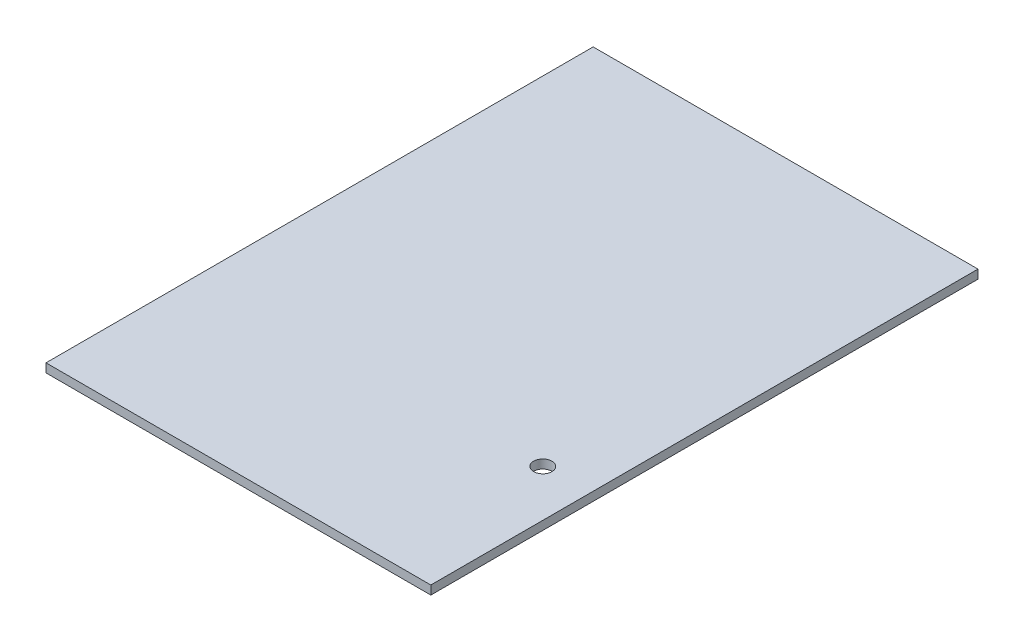
ISO-10303-21;
HEADER;
FILE_DESCRIPTION(('STEP AP214'),'2;1');
FILE_NAME('part.step','',(''),(''),'','','');
FILE_SCHEMA(('AUTOMOTIVE_DESIGN { 1 0 10303 214 1 1 1 1 }'));
ENDSEC;
DATA;
#1=APPLICATION_CONTEXT('core data for automotive mechanical design processes');
#2=APPLICATION_PROTOCOL_DEFINITION('international standard','automotive_design',2000,#1);
#3=PRODUCT_CONTEXT('',#1,'mechanical');
#4=PRODUCT('Part','Part','',(#3));
#5=PRODUCT_RELATED_PRODUCT_CATEGORY('part','',(#4));
#6=PRODUCT_DEFINITION_FORMATION('','',#4);
#7=PRODUCT_DEFINITION_CONTEXT('part definition',#1,'design');
#8=PRODUCT_DEFINITION('design','',#6,#7);
#9=PRODUCT_DEFINITION_SHAPE('','',#8);
#10=(LENGTH_UNIT() NAMED_UNIT(*) SI_UNIT(.MILLI.,.METRE.));
#11=(NAMED_UNIT(*) PLANE_ANGLE_UNIT() SI_UNIT($,.RADIAN.));
#12=(NAMED_UNIT(*) SI_UNIT($,.STERADIAN.) SOLID_ANGLE_UNIT());
#13=UNCERTAINTY_MEASURE_WITH_UNIT(LENGTH_MEASURE(1.E-05),#10,'distance_accuracy_value','');
#14=(GEOMETRIC_REPRESENTATION_CONTEXT(3) GLOBAL_UNCERTAINTY_ASSIGNED_CONTEXT((#13)) GLOBAL_UNIT_ASSIGNED_CONTEXT((#10,
#11,#12)) REPRESENTATION_CONTEXT('',''));
#15=CARTESIAN_POINT('',(0.,0.,0.));
#16=DIRECTION('',(0.,0.,1.));
#17=DIRECTION('',(1.,0.,0.));
#18=AXIS2_PLACEMENT_3D('',#15,#16,#17);
#19=CARTESIAN_POINT('',(0.,0.,0.));
#20=DIRECTION('',(0.,0.,1.));
#21=DIRECTION('',(1.,0.,0.));
#22=AXIS2_PLACEMENT_3D('',#19,#20,#21);
#23=PLANE('',#22);
#24=DIRECTION('',(-1.,0.,0.));
#25=VECTOR('',#24,1.);
#26=CARTESIAN_POINT('',(-262.506364446809,6.71891061329305,0.));
#27=LINE('',#26,#25);
#28=CARTESIAN_POINT('',(-194.506364446809,6.71891061329305,0.));
#29=VERTEX_POINT('',#28);
#30=CARTESIAN_POINT('',(-300.,6.71891061329305,0.));
#31=VERTEX_POINT('',#30);
#32=EDGE_CURVE('E51',#29,#31,#27,.T.);
#33=ORIENTED_EDGE('',*,*,#32,.T.);
#34=DIRECTION('',(0.,-1.,0.));
#35=VECTOR('',#34,1.);
#36=CARTESIAN_POINT('',(-300.,0.,0.));
#37=LINE('',#36,#35);
#38=CARTESIAN_POINT('',(-300.,9.11891061329305,0.));
#39=VERTEX_POINT('',#38);
#40=EDGE_CURVE('E38',#39,#31,#37,.T.);
#41=ORIENTED_EDGE('',*,*,#40,.F.);
#42=DIRECTION('',(-1.,0.,0.));
#43=VECTOR('',#42,1.);
#44=CARTESIAN_POINT('',(-304.054799780113,9.11891061329305,0.));
#45=LINE('',#44,#43);
#46=CARTESIAN_POINT('',(-194.506364446809,9.11891061329307,0.));
#47=VERTEX_POINT('',#46);
#48=EDGE_CURVE('E90',#47,#39,#45,.T.);
#49=ORIENTED_EDGE('',*,*,#48,.F.);
#50=DIRECTION('',(0.,1.,0.));
#51=VECTOR('',#50,1.);
#52=CARTESIAN_POINT('',(-194.506364446809,-59.3810893867069,0.));
#53=LINE('',#52,#51);
#54=EDGE_CURVE('E98',#29,#47,#53,.T.);
#55=ORIENTED_EDGE('',*,*,#54,.F.);
#56=EDGE_LOOP('',(#33,#41,#49,#55));
#57=FACE_BOUND('',#56,.T.);
#58=ADVANCED_FACE('F34',(#57),#23,.F.);
#59=CARTESIAN_POINT('',(-300.,0.,0.));
#60=DIRECTION('',(1.,0.,0.));
#61=DIRECTION('',(0.,0.,-1.));
#62=AXIS2_PLACEMENT_3D('',#59,#60,#61);
#63=PLANE('',#62);
#64=DIRECTION('',(0.,0.,1.));
#65=VECTOR('',#64,1.);
#66=CARTESIAN_POINT('',(-300.,6.71891061329305,-202.589640738144));
#67=LINE('',#66,#65);
#68=CARTESIAN_POINT('',(-300.,6.71891061329305,149.999999999977));
#69=VERTEX_POINT('',#68);
#70=EDGE_CURVE('E95',#31,#69,#67,.T.);
#71=ORIENTED_EDGE('',*,*,#70,.T.);
#72=DIRECTION('',(0.,-1.,0.));
#73=VECTOR('',#72,1.);
#74=CARTESIAN_POINT('',(-300.,0.,150.));
#75=LINE('',#74,#73);
#76=CARTESIAN_POINT('',(-300.,9.11891061329305,149.999999999977));
#77=VERTEX_POINT('',#76);
#78=EDGE_CURVE('E11',#77,#69,#75,.T.);
#79=ORIENTED_EDGE('',*,*,#78,.F.);
#80=DIRECTION('',(0.,0.,1.));
#81=VECTOR('',#80,1.);
#82=CARTESIAN_POINT('',(-300.,9.11891061329305,-149.499973367811));
#83=LINE('',#82,#81);
#84=EDGE_CURVE('E101',#39,#77,#83,.T.);
#85=ORIENTED_EDGE('',*,*,#84,.F.);
#86=ORIENTED_EDGE('',*,*,#40,.T.);
#87=EDGE_LOOP('',(#71,#79,#85,#86));
#88=FACE_BOUND('',#87,.T.);
#89=ADVANCED_FACE('F123',(#88),#63,.F.);
#90=CARTESIAN_POINT('',(1.11022302462516E-13,0.,150.));
#91=DIRECTION('',(0.,0.,1.));
#92=DIRECTION('',(1.,0.,0.));
#93=AXIS2_PLACEMENT_3D('',#90,#91,#92);
#94=PLANE('',#93);
#95=DIRECTION('',(-1.,0.,0.));
#96=VECTOR('',#95,1.);
#97=CARTESIAN_POINT('',(-262.506364446809,6.71891061329305,150.));
#98=LINE('',#97,#96);
#99=CARTESIAN_POINT('',(-194.506364446809,6.71891061329305,150.));
#100=VERTEX_POINT('',#99);
#101=EDGE_CURVE('E81',#100,#69,#98,.T.);
#102=ORIENTED_EDGE('',*,*,#101,.F.);
#103=DIRECTION('',(0.,1.,0.));
#104=VECTOR('',#103,1.);
#105=CARTESIAN_POINT('',(-194.506364446809,-59.3810893867069,150.));
#106=LINE('',#105,#104);
#107=CARTESIAN_POINT('',(-194.506364446809,9.11891061329307,150.));
#108=VERTEX_POINT('',#107);
#109=EDGE_CURVE('E89',#100,#108,#106,.T.);
#110=ORIENTED_EDGE('',*,*,#109,.T.);
#111=DIRECTION('',(-1.,0.,0.));
#112=VECTOR('',#111,1.);
#113=CARTESIAN_POINT('',(-304.054799780113,9.11891061329305,150.));
#114=LINE('',#113,#112);
#115=EDGE_CURVE('E94',#108,#77,#114,.T.);
#116=ORIENTED_EDGE('',*,*,#115,.T.);
#117=ORIENTED_EDGE('',*,*,#78,.T.);
#118=EDGE_LOOP('',(#102,#110,#116,#117));
#119=FACE_BOUND('',#118,.T.);
#120=ADVANCED_FACE('F88',(#119),#94,.T.);
#121=CARTESIAN_POINT('',(-207.314666717196,16.7189106132931,106.5));
#122=DIRECTION('',(0.,-1.,0.));
#123=DIRECTION('',(0.,0.,-1.));
#124=AXIS2_PLACEMENT_3D('',#121,#122,#123);
#125=CYLINDRICAL_SURFACE('',#124,2.5);
#126=CARTESIAN_POINT('',(-207.314666717196,6.71891061329305,106.5));
#127=DIRECTION('',(0.,-1.,0.));
#128=DIRECTION('',(0.,0.,-1.));
#129=AXIS2_PLACEMENT_3D('',#126,#127,#128);
#130=CIRCLE('',#129,2.5);
#131=CARTESIAN_POINT('',(-207.314666717196,6.71891061329305,104.));
#132=VERTEX_POINT('',#131);
#133=EDGE_CURVE('E43',#132,#132,#130,.T.);
#134=ORIENTED_EDGE('',*,*,#133,.T.);
#135=EDGE_LOOP('',(#134));
#136=FACE_BOUND('',#135,.T.);
#137=CARTESIAN_POINT('',(-207.314666717196,9.11891061329307,106.5));
#138=DIRECTION('',(0.,-1.,0.));
#139=DIRECTION('',(1.,0.,0.));
#140=AXIS2_PLACEMENT_3D('',#137,#138,#139);
#141=CIRCLE('',#140,2.5);
#142=CARTESIAN_POINT('',(-204.814666717196,9.11891061329307,106.5));
#143=VERTEX_POINT('',#142);
#144=EDGE_CURVE('E84',#143,#143,#141,.T.);
#145=ORIENTED_EDGE('',*,*,#144,.F.);
#146=EDGE_LOOP('',(#145));
#147=FACE_BOUND('',#146,.T.);
#148=ADVANCED_FACE('F114',(#136,#147),#125,.F.);
#149=CARTESIAN_POINT('',(-304.054799780113,9.11891061329305,-149.499973367811));
#150=DIRECTION('',(0.,-1.,0.));
#151=DIRECTION('',(1.,0.,0.));
#152=AXIS2_PLACEMENT_3D('',#149,#150,#151);
#153=PLANE('',#152);
#154=ORIENTED_EDGE('',*,*,#144,.T.);
#155=EDGE_LOOP('',(#154));
#156=FACE_BOUND('',#155,.T.);
#157=ORIENTED_EDGE('',*,*,#115,.F.);
#158=DIRECTION('',(0.,0.,-1.));
#159=VECTOR('',#158,1.);
#160=CARTESIAN_POINT('',(-194.506364446809,9.11891061329307,-149.499973367811));
#161=LINE('',#160,#159);
#162=EDGE_CURVE('E85',#108,#47,#161,.T.);
#163=ORIENTED_EDGE('',*,*,#162,.T.);
#164=ORIENTED_EDGE('',*,*,#48,.T.);
#165=ORIENTED_EDGE('',*,*,#84,.T.);
#166=EDGE_LOOP('',(#157,#163,#164,#165));
#167=FACE_BOUND('',#166,.T.);
#168=ADVANCED_FACE('F111',(#156,#167),#153,.F.);
#169=CARTESIAN_POINT('',(-262.506364446809,6.71891061329305,-202.589640738144));
#170=DIRECTION('',(0.,-1.,0.));
#171=DIRECTION('',(0.,0.,-1.));
#172=AXIS2_PLACEMENT_3D('',#169,#170,#171);
#173=PLANE('',#172);
#174=ORIENTED_EDGE('',*,*,#133,.F.);
#175=EDGE_LOOP('',(#174));
#176=FACE_BOUND('',#175,.T.);
#177=DIRECTION('',(0.,0.,-1.));
#178=VECTOR('',#177,1.);
#179=CARTESIAN_POINT('',(-194.506364446809,6.71891061329305,-202.589640738144));
#180=LINE('',#179,#178);
#181=EDGE_CURVE('E78',#100,#29,#180,.T.);
#182=ORIENTED_EDGE('',*,*,#181,.F.);
#183=ORIENTED_EDGE('',*,*,#101,.T.);
#184=ORIENTED_EDGE('',*,*,#70,.F.);
#185=ORIENTED_EDGE('',*,*,#32,.F.);
#186=EDGE_LOOP('',(#182,#183,#184,#185));
#187=FACE_BOUND('',#186,.T.);
#188=ADVANCED_FACE('F79',(#176,#187),#173,.T.);
#189=CARTESIAN_POINT('',(-194.506364446809,-59.3810893867069,-213.500026632189));
#190=DIRECTION('',(-1.,0.,0.));
#191=DIRECTION('',(0.,-1.,0.));
#192=AXIS2_PLACEMENT_3D('',#189,#190,#191);
#193=PLANE('',#192);
#194=ORIENTED_EDGE('',*,*,#109,.F.);
#195=ORIENTED_EDGE('',*,*,#181,.T.);
#196=ORIENTED_EDGE('',*,*,#54,.T.);
#197=ORIENTED_EDGE('',*,*,#162,.F.);
#198=EDGE_LOOP('',(#194,#195,#196,#197));
#199=FACE_BOUND('',#198,.T.);
#200=ADVANCED_FACE('F36',(#199),#193,.F.);
#201=CLOSED_SHELL('',(#58,#89,#120,#148,#168,#188,#200));
#202=MANIFOLD_SOLID_BREP('B2',#201);
#203=ADVANCED_BREP_SHAPE_REPRESENTATION('',(#18,#202),#14);
#204=SHAPE_DEFINITION_REPRESENTATION(#9,#203);
ENDSEC;
END-ISO-10303-21;
